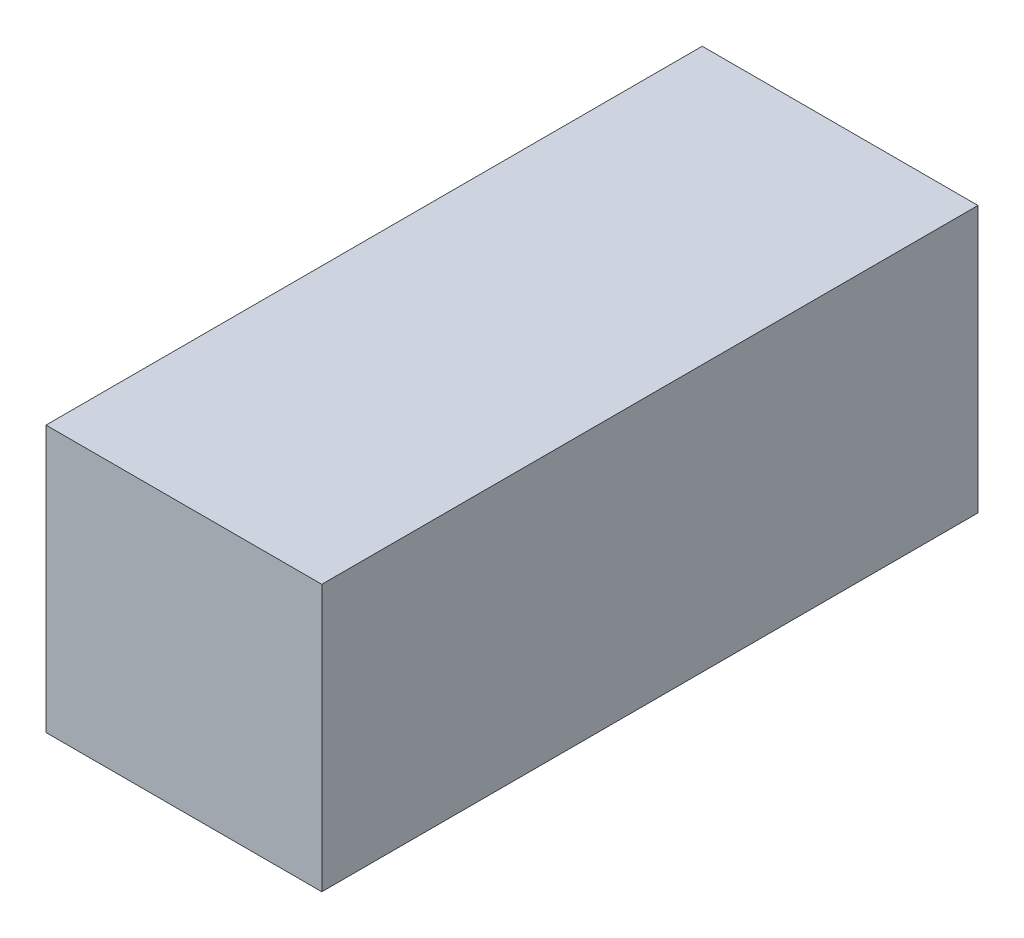
ISO-10303-21;
HEADER;
FILE_DESCRIPTION(('STEP AP214'),'2;1');
FILE_NAME('part.step','',(''),(''),'','','');
FILE_SCHEMA(('AUTOMOTIVE_DESIGN { 1 0 10303 214 1 1 1 1 }'));
ENDSEC;
DATA;
#1=APPLICATION_CONTEXT('core data for automotive mechanical design processes');
#2=APPLICATION_PROTOCOL_DEFINITION('international standard','automotive_design',2000,#1);
#3=PRODUCT_CONTEXT('',#1,'mechanical');
#4=PRODUCT('Part','Part','',(#3));
#5=PRODUCT_RELATED_PRODUCT_CATEGORY('part','',(#4));
#6=PRODUCT_DEFINITION_FORMATION('','',#4);
#7=PRODUCT_DEFINITION_CONTEXT('part definition',#1,'design');
#8=PRODUCT_DEFINITION('design','',#6,#7);
#9=PRODUCT_DEFINITION_SHAPE('','',#8);
#10=(LENGTH_UNIT() NAMED_UNIT(*) SI_UNIT(.MILLI.,.METRE.));
#11=(NAMED_UNIT(*) PLANE_ANGLE_UNIT() SI_UNIT($,.RADIAN.));
#12=(NAMED_UNIT(*) SI_UNIT($,.STERADIAN.) SOLID_ANGLE_UNIT());
#13=UNCERTAINTY_MEASURE_WITH_UNIT(LENGTH_MEASURE(1.E-05),#10,'distance_accuracy_value','');
#14=(GEOMETRIC_REPRESENTATION_CONTEXT(3) GLOBAL_UNCERTAINTY_ASSIGNED_CONTEXT((#13)) GLOBAL_UNIT_ASSIGNED_CONTEXT((#10,
#11,#12)) REPRESENTATION_CONTEXT('',''));
#15=CARTESIAN_POINT('',(0.,0.,0.));
#16=DIRECTION('',(0.,0.,1.));
#17=DIRECTION('',(1.,0.,0.));
#18=AXIS2_PLACEMENT_3D('',#15,#16,#17);
#19=CARTESIAN_POINT('',(73.66,0.,0.));
#20=DIRECTION('',(0.,0.,-1.));
#21=DIRECTION('',(-1.,0.,0.));
#22=AXIS2_PLACEMENT_3D('',#19,#20,#21);
#23=PLANE('',#22);
#24=DIRECTION('',(0.,-1.,0.));
#25=VECTOR('',#24,1.);
#26=CARTESIAN_POINT('',(0.,0.,0.));
#27=LINE('',#26,#25);
#28=CARTESIAN_POINT('',(0.,71.1200000000001,0.));
#29=VERTEX_POINT('',#28);
#30=CARTESIAN_POINT('',(0.,0.,0.));
#31=VERTEX_POINT('',#30);
#32=EDGE_CURVE('E99',#29,#31,#27,.T.);
#33=ORIENTED_EDGE('',*,*,#32,.T.);
#34=DIRECTION('',(-1.,0.,0.));
#35=VECTOR('',#34,1.);
#36=CARTESIAN_POINT('',(73.66,0.,0.));
#37=LINE('',#36,#35);
#38=CARTESIAN_POINT('',(73.66,0.,0.));
#39=VERTEX_POINT('',#38);
#40=EDGE_CURVE('E11',#39,#31,#37,.T.);
#41=ORIENTED_EDGE('',*,*,#40,.F.);
#42=DIRECTION('',(0.,-1.,0.));
#43=VECTOR('',#42,1.);
#44=CARTESIAN_POINT('',(73.66,0.,0.));
#45=LINE('',#44,#43);
#46=CARTESIAN_POINT('',(73.66,71.1200000000001,0.));
#47=VERTEX_POINT('',#46);
#48=EDGE_CURVE('E87',#47,#39,#45,.T.);
#49=ORIENTED_EDGE('',*,*,#48,.F.);
#50=DIRECTION('',(-1.,0.,0.));
#51=VECTOR('',#50,1.);
#52=CARTESIAN_POINT('',(73.66,71.1200000000001,0.));
#53=LINE('',#52,#51);
#54=EDGE_CURVE('E95',#47,#29,#53,.T.);
#55=ORIENTED_EDGE('',*,*,#54,.T.);
#56=EDGE_LOOP('',(#33,#41,#49,#55));
#57=FACE_BOUND('',#56,.T.);
#58=ADVANCED_FACE('F36',(#57),#23,.F.);
#59=CARTESIAN_POINT('',(73.66,0.,0.));
#60=DIRECTION('',(0.,1.,0.));
#61=DIRECTION('',(0.,0.,1.));
#62=AXIS2_PLACEMENT_3D('',#59,#60,#61);
#63=PLANE('',#62);
#64=DIRECTION('',(0.,0.,-1.));
#65=VECTOR('',#64,1.);
#66=CARTESIAN_POINT('',(0.,0.,0.));
#67=LINE('',#66,#65);
#68=CARTESIAN_POINT('',(0.,0.,-175.26));
#69=VERTEX_POINT('',#68);
#70=EDGE_CURVE('E91',#31,#69,#67,.T.);
#71=ORIENTED_EDGE('',*,*,#70,.T.);
#72=DIRECTION('',(-1.,0.,0.));
#73=VECTOR('',#72,1.);
#74=CARTESIAN_POINT('',(73.66,0.,-175.26));
#75=LINE('',#74,#73);
#76=CARTESIAN_POINT('',(73.66,0.,-175.26));
#77=VERTEX_POINT('',#76);
#78=EDGE_CURVE('E44',#77,#69,#75,.T.);
#79=ORIENTED_EDGE('',*,*,#78,.F.);
#80=DIRECTION('',(0.,0.,-1.));
#81=VECTOR('',#80,1.);
#82=CARTESIAN_POINT('',(73.66,0.,0.));
#83=LINE('',#82,#81);
#84=EDGE_CURVE('E82',#39,#77,#83,.T.);
#85=ORIENTED_EDGE('',*,*,#84,.F.);
#86=ORIENTED_EDGE('',*,*,#40,.T.);
#87=EDGE_LOOP('',(#71,#79,#85,#86));
#88=FACE_BOUND('',#87,.T.);
#89=ADVANCED_FACE('F90',(#88),#63,.F.);
#90=CARTESIAN_POINT('',(73.66,0.,-175.26));
#91=DIRECTION('',(0.,0.,1.));
#92=DIRECTION('',(1.,0.,0.));
#93=AXIS2_PLACEMENT_3D('',#90,#91,#92);
#94=PLANE('',#93);
#95=DIRECTION('',(0.,1.,0.));
#96=VECTOR('',#95,1.);
#97=CARTESIAN_POINT('',(0.,0.,-175.26));
#98=LINE('',#97,#96);
#99=CARTESIAN_POINT('',(0.,71.1200000000001,-175.26));
#100=VERTEX_POINT('',#99);
#101=EDGE_CURVE('E69',#69,#100,#98,.T.);
#102=ORIENTED_EDGE('',*,*,#101,.T.);
#103=DIRECTION('',(-1.,0.,0.));
#104=VECTOR('',#103,1.);
#105=CARTESIAN_POINT('',(73.66,71.1200000000001,-175.26));
#106=LINE('',#105,#104);
#107=CARTESIAN_POINT('',(73.66,71.1200000000001,-175.26));
#108=VERTEX_POINT('',#107);
#109=EDGE_CURVE('E92',#108,#100,#106,.T.);
#110=ORIENTED_EDGE('',*,*,#109,.F.);
#111=DIRECTION('',(0.,1.,0.));
#112=VECTOR('',#111,1.);
#113=CARTESIAN_POINT('',(73.66,0.,-175.26));
#114=LINE('',#113,#112);
#115=EDGE_CURVE('E85',#77,#108,#114,.T.);
#116=ORIENTED_EDGE('',*,*,#115,.F.);
#117=ORIENTED_EDGE('',*,*,#78,.T.);
#118=EDGE_LOOP('',(#102,#110,#116,#117));
#119=FACE_BOUND('',#118,.T.);
#120=ADVANCED_FACE('F93',(#119),#94,.F.);
#121=CARTESIAN_POINT('',(73.66,71.1200000000001,0.));
#122=DIRECTION('',(0.,-1.,0.));
#123=DIRECTION('',(0.,0.,-1.));
#124=AXIS2_PLACEMENT_3D('',#121,#122,#123);
#125=PLANE('',#124);
#126=DIRECTION('',(0.,0.,1.));
#127=VECTOR('',#126,1.);
#128=CARTESIAN_POINT('',(0.,71.1200000000001,0.));
#129=LINE('',#128,#127);
#130=EDGE_CURVE('E75',#100,#29,#129,.T.);
#131=ORIENTED_EDGE('',*,*,#130,.T.);
#132=ORIENTED_EDGE('',*,*,#54,.F.);
#133=DIRECTION('',(0.,0.,1.));
#134=VECTOR('',#133,1.);
#135=CARTESIAN_POINT('',(73.66,71.1200000000001,0.));
#136=LINE('',#135,#134);
#137=EDGE_CURVE('E52',#108,#47,#136,.T.);
#138=ORIENTED_EDGE('',*,*,#137,.F.);
#139=ORIENTED_EDGE('',*,*,#109,.T.);
#140=EDGE_LOOP('',(#131,#132,#138,#139));
#141=FACE_BOUND('',#140,.T.);
#142=ADVANCED_FACE('F106',(#141),#125,.F.);
#143=CARTESIAN_POINT('',(73.66,0.,0.));
#144=DIRECTION('',(-1.,0.,0.));
#145=DIRECTION('',(0.,0.,1.));
#146=AXIS2_PLACEMENT_3D('',#143,#144,#145);
#147=PLANE('',#146);
#148=ORIENTED_EDGE('',*,*,#48,.T.);
#149=ORIENTED_EDGE('',*,*,#84,.T.);
#150=ORIENTED_EDGE('',*,*,#115,.T.);
#151=ORIENTED_EDGE('',*,*,#137,.T.);
#152=EDGE_LOOP('',(#148,#149,#150,#151));
#153=FACE_BOUND('',#152,.T.);
#154=ADVANCED_FACE('F83',(#153),#147,.F.);
#155=CARTESIAN_POINT('',(0.,0.,0.));
#156=DIRECTION('',(-1.,0.,0.));
#157=DIRECTION('',(0.,0.,1.));
#158=AXIS2_PLACEMENT_3D('',#155,#156,#157);
#159=PLANE('',#158);
#160=ORIENTED_EDGE('',*,*,#32,.F.);
#161=ORIENTED_EDGE('',*,*,#130,.F.);
#162=ORIENTED_EDGE('',*,*,#101,.F.);
#163=ORIENTED_EDGE('',*,*,#70,.F.);
#164=EDGE_LOOP('',(#160,#161,#162,#163));
#165=FACE_BOUND('',#164,.T.);
#166=ADVANCED_FACE('F109',(#165),#159,.T.);
#167=CLOSED_SHELL('',(#58,#89,#120,#142,#154,#166));
#168=MANIFOLD_SOLID_BREP('B2',#167);
#169=ADVANCED_BREP_SHAPE_REPRESENTATION('',(#18,#168),#14);
#170=SHAPE_DEFINITION_REPRESENTATION(#9,#169);
ENDSEC;
END-ISO-10303-21;
